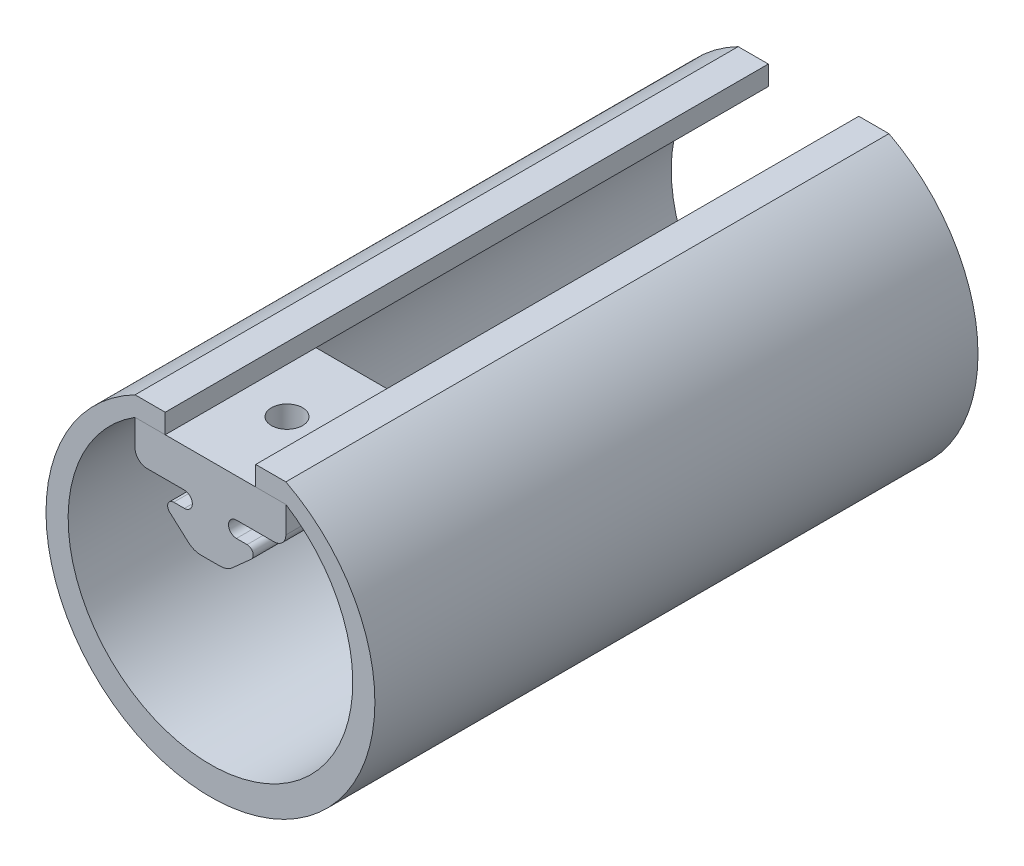
ISO-10303-21;
HEADER;
FILE_DESCRIPTION(('STEP AP214'),'2;1');
FILE_NAME('part.step','',(''),(''),'','','');
FILE_SCHEMA(('AUTOMOTIVE_DESIGN { 1 0 10303 214 1 1 1 1 }'));
ENDSEC;
DATA;
#1=APPLICATION_CONTEXT('core data for automotive mechanical design processes');
#2=APPLICATION_PROTOCOL_DEFINITION('international standard','automotive_design',2000,#1);
#3=PRODUCT_CONTEXT('',#1,'mechanical');
#4=PRODUCT('Part','Part','',(#3));
#5=PRODUCT_RELATED_PRODUCT_CATEGORY('part','',(#4));
#6=PRODUCT_DEFINITION_FORMATION('','',#4);
#7=PRODUCT_DEFINITION_CONTEXT('part definition',#1,'design');
#8=PRODUCT_DEFINITION('design','',#6,#7);
#9=PRODUCT_DEFINITION_SHAPE('','',#8);
#10=(LENGTH_UNIT() NAMED_UNIT(*) SI_UNIT(.MILLI.,.METRE.));
#11=(NAMED_UNIT(*) PLANE_ANGLE_UNIT() SI_UNIT($,.RADIAN.));
#12=(NAMED_UNIT(*) SI_UNIT($,.STERADIAN.) SOLID_ANGLE_UNIT());
#13=UNCERTAINTY_MEASURE_WITH_UNIT(LENGTH_MEASURE(1.E-05),#10,'distance_accuracy_value','');
#14=(GEOMETRIC_REPRESENTATION_CONTEXT(3) GLOBAL_UNCERTAINTY_ASSIGNED_CONTEXT((#13)) GLOBAL_UNIT_ASSIGNED_CONTEXT((#10,
#11,#12)) REPRESENTATION_CONTEXT('',''));
#15=CARTESIAN_POINT('',(0.,0.,0.));
#16=DIRECTION('',(0.,0.,1.));
#17=DIRECTION('',(1.,0.,0.));
#18=AXIS2_PLACEMENT_3D('',#15,#16,#17);
#19=CARTESIAN_POINT('',(0.00499999999999459,-0.919738421910336,-100.));
#20=DIRECTION('',(0.,0.,1.));
#21=DIRECTION('',(1.,0.,0.));
#22=AXIS2_PLACEMENT_3D('',#19,#20,#21);
#23=CYLINDRICAL_SURFACE('',#22,23.5974522798012);
#24=CARTESIAN_POINT('',(0.00499999999999459,-0.919738421910336,0.));
#25=DIRECTION('',(0.,0.,1.));
#26=DIRECTION('',(1.,0.,0.));
#27=AXIS2_PLACEMENT_3D('',#24,#25,#26);
#28=CIRCLE('',#27,23.5974522798012);
#29=CARTESIAN_POINT('',(-12.495,19.095,0.));
#30=VERTEX_POINT('',#29);
#31=CARTESIAN_POINT('',(12.505,19.095,0.));
#32=VERTEX_POINT('',#31);
#33=EDGE_CURVE('E158',#30,#32,#28,.T.);
#34=ORIENTED_EDGE('',*,*,#33,.T.);
#35=DIRECTION('',(0.,0.,1.));
#36=VECTOR('',#35,1.);
#37=CARTESIAN_POINT('',(12.505,19.095,-100.));
#38=LINE('',#37,#36);
#39=CARTESIAN_POINT('',(12.505,19.095,-100.));
#40=VERTEX_POINT('',#39);
#41=EDGE_CURVE('E12',#40,#32,#38,.T.);
#42=ORIENTED_EDGE('',*,*,#41,.F.);
#43=CARTESIAN_POINT('',(0.00499999999999459,-0.919738421910336,-100.));
#44=DIRECTION('',(0.,0.,1.));
#45=DIRECTION('',(1.,0.,0.));
#46=AXIS2_PLACEMENT_3D('',#43,#44,#45);
#47=CIRCLE('',#46,23.5974522798012);
#48=CARTESIAN_POINT('',(-12.495,19.095,-100.));
#49=VERTEX_POINT('',#48);
#50=EDGE_CURVE('E181',#49,#40,#47,.T.);
#51=ORIENTED_EDGE('',*,*,#50,.F.);
#52=DIRECTION('',(0.,0.,1.));
#53=VECTOR('',#52,1.);
#54=CARTESIAN_POINT('',(-12.495,19.095,-100.));
#55=LINE('',#54,#53);
#56=EDGE_CURVE('E62',#49,#30,#55,.T.);
#57=ORIENTED_EDGE('',*,*,#56,.T.);
#58=EDGE_LOOP('',(#34,#42,#51,#57));
#59=FACE_BOUND('',#58,.T.);
#60=ADVANCED_FACE('F59',(#59),#23,.F.);
#61=CARTESIAN_POINT('',(0.,19.095,-100.));
#62=DIRECTION('',(0.,1.,0.));
#63=DIRECTION('',(0.,0.,1.));
#64=AXIS2_PLACEMENT_3D('',#61,#62,#63);
#65=PLANE('',#64);
#66=DIRECTION('',(-1.,0.,0.));
#67=VECTOR('',#66,1.);
#68=CARTESIAN_POINT('',(0.,19.095,0.));
#69=LINE('',#68,#67);
#70=CARTESIAN_POINT('',(7.50499999999998,19.095,0.));
#71=VERTEX_POINT('',#70);
#72=EDGE_CURVE('E111',#32,#71,#69,.T.);
#73=ORIENTED_EDGE('',*,*,#72,.T.);
#74=DIRECTION('',(0.,0.,1.));
#75=VECTOR('',#74,1.);
#76=CARTESIAN_POINT('',(7.50499999999998,19.095,-100.));
#77=LINE('',#76,#75);
#78=CARTESIAN_POINT('',(7.50499999999998,19.095,-100.));
#79=VERTEX_POINT('',#78);
#80=EDGE_CURVE('E69',#79,#71,#77,.T.);
#81=ORIENTED_EDGE('',*,*,#80,.F.);
#82=DIRECTION('',(-1.,0.,0.));
#83=VECTOR('',#82,1.);
#84=CARTESIAN_POINT('',(0.,19.095,-100.));
#85=LINE('',#84,#83);
#86=EDGE_CURVE('E77',#40,#79,#85,.T.);
#87=ORIENTED_EDGE('',*,*,#86,.F.);
#88=ORIENTED_EDGE('',*,*,#41,.T.);
#89=EDGE_LOOP('',(#73,#81,#87,#88));
#90=FACE_BOUND('',#89,.T.);
#91=ADVANCED_FACE('F219',(#90),#65,.F.);
#92=CARTESIAN_POINT('',(7.50499999999998,0.,-100.));
#93=DIRECTION('',(-1.,0.,0.));
#94=DIRECTION('',(0.,0.,1.));
#95=AXIS2_PLACEMENT_3D('',#92,#93,#94);
#96=PLANE('',#95);
#97=DIRECTION('',(0.,-1.,0.));
#98=VECTOR('',#97,1.);
#99=CARTESIAN_POINT('',(7.50499999999998,0.,0.));
#100=LINE('',#99,#98);
#101=CARTESIAN_POINT('',(7.50499999999998,22.3323580948041,0.));
#102=VERTEX_POINT('',#101);
#103=EDGE_CURVE('E136',#102,#71,#100,.T.);
#104=ORIENTED_EDGE('',*,*,#103,.F.);
#105=DIRECTION('',(0.,0.,1.));
#106=VECTOR('',#105,1.);
#107=CARTESIAN_POINT('',(7.50499999999998,22.3323580948041,-100.));
#108=LINE('',#107,#106);
#109=CARTESIAN_POINT('',(7.50499999999998,22.3323580948041,-100.));
#110=VERTEX_POINT('',#109);
#111=EDGE_CURVE('E131',#110,#102,#108,.T.);
#112=ORIENTED_EDGE('',*,*,#111,.F.);
#113=DIRECTION('',(0.,-1.,0.));
#114=VECTOR('',#113,1.);
#115=CARTESIAN_POINT('',(7.50499999999998,0.,-100.));
#116=LINE('',#115,#114);
#117=EDGE_CURVE('E135',#110,#79,#116,.T.);
#118=ORIENTED_EDGE('',*,*,#117,.T.);
#119=ORIENTED_EDGE('',*,*,#80,.T.);
#120=EDGE_LOOP('',(#104,#112,#118,#119));
#121=FACE_BOUND('',#120,.T.);
#122=ADVANCED_FACE('F133',(#121),#96,.T.);
#123=CARTESIAN_POINT('',(0.,22.3323580948041,-100.));
#124=DIRECTION('',(0.,-1.,0.));
#125=DIRECTION('',(0.,0.,-1.));
#126=AXIS2_PLACEMENT_3D('',#123,#124,#125);
#127=PLANE('',#126);
#128=DIRECTION('',(1.,0.,0.));
#129=VECTOR('',#128,1.);
#130=CARTESIAN_POINT('',(0.,22.3323580948041,0.));
#131=LINE('',#130,#129);
#132=CARTESIAN_POINT('',(12.505,22.3323580948041,0.));
#133=VERTEX_POINT('',#132);
#134=EDGE_CURVE('E175',#102,#133,#131,.T.);
#135=ORIENTED_EDGE('',*,*,#134,.T.);
#136=DIRECTION('',(0.,0.,1.));
#137=VECTOR('',#136,1.);
#138=CARTESIAN_POINT('',(12.505,22.3323580948041,-100.));
#139=LINE('',#138,#137);
#140=CARTESIAN_POINT('',(12.505,22.3323580948041,-100.));
#141=VERTEX_POINT('',#140);
#142=EDGE_CURVE('E141',#141,#133,#139,.T.);
#143=ORIENTED_EDGE('',*,*,#142,.F.);
#144=DIRECTION('',(1.,0.,0.));
#145=VECTOR('',#144,1.);
#146=CARTESIAN_POINT('',(0.,22.3323580948041,-100.));
#147=LINE('',#146,#145);
#148=EDGE_CURVE('E144',#110,#141,#147,.T.);
#149=ORIENTED_EDGE('',*,*,#148,.F.);
#150=ORIENTED_EDGE('',*,*,#111,.T.);
#151=EDGE_LOOP('',(#135,#143,#149,#150));
#152=FACE_BOUND('',#151,.T.);
#153=ADVANCED_FACE('F145',(#152),#127,.F.);
#154=CARTESIAN_POINT('',(0.00499999999999459,-1.9006750931802,-100.));
#155=DIRECTION('',(0.,0.,1.));
#156=DIRECTION('',(1.,0.,0.));
#157=AXIS2_PLACEMENT_3D('',#154,#155,#156);
#158=CYLINDRICAL_SURFACE('',#157,27.2670111579899);
#159=CARTESIAN_POINT('',(0.00499999999999459,-1.9006750931802,0.));
#160=DIRECTION('',(0.,0.,1.));
#161=DIRECTION('',(1.,0.,0.));
#162=AXIS2_PLACEMENT_3D('',#159,#160,#161);
#163=CIRCLE('',#162,27.2670111579899);
#164=CARTESIAN_POINT('',(-12.495,22.3323580948041,0.));
#165=VERTEX_POINT('',#164);
#166=EDGE_CURVE('E171',#165,#133,#163,.T.);
#167=ORIENTED_EDGE('',*,*,#166,.F.);
#168=DIRECTION('',(0.,0.,1.));
#169=VECTOR('',#168,1.);
#170=CARTESIAN_POINT('',(-12.495,22.3323580948041,-100.));
#171=LINE('',#170,#169);
#172=CARTESIAN_POINT('',(-12.495,22.3323580948041,-100.));
#173=VERTEX_POINT('',#172);
#174=EDGE_CURVE('E187',#173,#165,#171,.T.);
#175=ORIENTED_EDGE('',*,*,#174,.F.);
#176=CARTESIAN_POINT('',(0.00499999999999459,-1.9006750931802,-100.));
#177=DIRECTION('',(0.,0.,1.));
#178=DIRECTION('',(1.,0.,0.));
#179=AXIS2_PLACEMENT_3D('',#176,#177,#178);
#180=CIRCLE('',#179,27.2670111579899);
#181=EDGE_CURVE('E149',#173,#141,#180,.T.);
#182=ORIENTED_EDGE('',*,*,#181,.T.);
#183=ORIENTED_EDGE('',*,*,#142,.T.);
#184=EDGE_LOOP('',(#167,#175,#182,#183));
#185=FACE_BOUND('',#184,.T.);
#186=ADVANCED_FACE('F232',(#185),#158,.T.);
#187=CARTESIAN_POINT('',(0.,22.3323580948041,-100.));
#188=DIRECTION('',(0.,-1.,0.));
#189=DIRECTION('',(0.,0.,-1.));
#190=AXIS2_PLACEMENT_3D('',#187,#188,#189);
#191=PLANE('',#190);
#192=DIRECTION('',(1.,0.,0.));
#193=VECTOR('',#192,1.);
#194=CARTESIAN_POINT('',(0.,22.3323580948041,0.));
#195=LINE('',#194,#193);
#196=CARTESIAN_POINT('',(-7.49499999999999,22.3323580948041,0.));
#197=VERTEX_POINT('',#196);
#198=EDGE_CURVE('E168',#165,#197,#195,.T.);
#199=ORIENTED_EDGE('',*,*,#198,.T.);
#200=DIRECTION('',(0.,0.,1.));
#201=VECTOR('',#200,1.);
#202=CARTESIAN_POINT('',(-7.49499999999999,22.3323580948041,-100.));
#203=LINE('',#202,#201);
#204=CARTESIAN_POINT('',(-7.49499999999999,22.3323580948041,-100.));
#205=VERTEX_POINT('',#204);
#206=EDGE_CURVE('E190',#205,#197,#203,.T.);
#207=ORIENTED_EDGE('',*,*,#206,.F.);
#208=DIRECTION('',(1.,0.,0.));
#209=VECTOR('',#208,1.);
#210=CARTESIAN_POINT('',(0.,22.3323580948041,-100.));
#211=LINE('',#210,#209);
#212=EDGE_CURVE('E246',#173,#205,#211,.T.);
#213=ORIENTED_EDGE('',*,*,#212,.F.);
#214=ORIENTED_EDGE('',*,*,#174,.T.);
#215=EDGE_LOOP('',(#199,#207,#213,#214));
#216=FACE_BOUND('',#215,.T.);
#217=ADVANCED_FACE('F215',(#216),#191,.F.);
#218=CARTESIAN_POINT('',(-7.49499999999999,0.,-100.));
#219=DIRECTION('',(-1.,0.,0.));
#220=DIRECTION('',(0.,-1.,0.));
#221=AXIS2_PLACEMENT_3D('',#218,#219,#220);
#222=PLANE('',#221);
#223=DIRECTION('',(0.,-1.,0.));
#224=VECTOR('',#223,1.);
#225=CARTESIAN_POINT('',(-7.49499999999999,0.,0.));
#226=LINE('',#225,#224);
#227=CARTESIAN_POINT('',(-7.49499999999999,19.095,0.));
#228=VERTEX_POINT('',#227);
#229=EDGE_CURVE('E165',#197,#228,#226,.T.);
#230=ORIENTED_EDGE('',*,*,#229,.T.);
#231=DIRECTION('',(0.,0.,1.));
#232=VECTOR('',#231,1.);
#233=CARTESIAN_POINT('',(-7.49499999999999,19.095,-100.));
#234=LINE('',#233,#232);
#235=CARTESIAN_POINT('',(-7.49499999999999,19.095,-100.));
#236=VERTEX_POINT('',#235);
#237=EDGE_CURVE('E193',#236,#228,#234,.T.);
#238=ORIENTED_EDGE('',*,*,#237,.F.);
#239=DIRECTION('',(0.,-1.,0.));
#240=VECTOR('',#239,1.);
#241=CARTESIAN_POINT('',(-7.49499999999999,0.,-100.));
#242=LINE('',#241,#240);
#243=EDGE_CURVE('E244',#205,#236,#242,.T.);
#244=ORIENTED_EDGE('',*,*,#243,.F.);
#245=ORIENTED_EDGE('',*,*,#206,.T.);
#246=EDGE_LOOP('',(#230,#238,#244,#245));
#247=FACE_BOUND('',#246,.T.);
#248=ADVANCED_FACE('F209',(#247),#222,.F.);
#249=CARTESIAN_POINT('',(0.,19.095,-100.));
#250=DIRECTION('',(0.,1.,0.));
#251=DIRECTION('',(0.,0.,1.));
#252=AXIS2_PLACEMENT_3D('',#249,#250,#251);
#253=PLANE('',#252);
#254=DIRECTION('',(-1.,0.,0.));
#255=VECTOR('',#254,1.);
#256=CARTESIAN_POINT('',(0.,19.095,0.));
#257=LINE('',#256,#255);
#258=EDGE_CURVE('E162',#228,#30,#257,.T.);
#259=ORIENTED_EDGE('',*,*,#258,.T.);
#260=ORIENTED_EDGE('',*,*,#56,.F.);
#261=DIRECTION('',(-1.,0.,0.));
#262=VECTOR('',#261,1.);
#263=CARTESIAN_POINT('',(0.,19.095,-100.));
#264=LINE('',#263,#262);
#265=EDGE_CURVE('E118',#236,#49,#264,.T.);
#266=ORIENTED_EDGE('',*,*,#265,.F.);
#267=ORIENTED_EDGE('',*,*,#237,.T.);
#268=EDGE_LOOP('',(#259,#260,#266,#267));
#269=FACE_BOUND('',#268,.T.);
#270=ADVANCED_FACE('F207',(#269),#253,.F.);
#271=CARTESIAN_POINT('',(0.,0.,-100.));
#272=DIRECTION('',(0.,0.,1.));
#273=DIRECTION('',(1.,0.,0.));
#274=AXIS2_PLACEMENT_3D('',#271,#272,#273);
#275=PLANE('',#274);
#276=ORIENTED_EDGE('',*,*,#50,.T.);
#277=ORIENTED_EDGE('',*,*,#86,.T.);
#278=ORIENTED_EDGE('',*,*,#117,.F.);
#279=ORIENTED_EDGE('',*,*,#148,.T.);
#280=ORIENTED_EDGE('',*,*,#181,.F.);
#281=ORIENTED_EDGE('',*,*,#212,.T.);
#282=ORIENTED_EDGE('',*,*,#243,.T.);
#283=ORIENTED_EDGE('',*,*,#265,.T.);
#284=EDGE_LOOP('',(#276,#277,#278,#279,#280,#281,#282,#283));
#285=FACE_BOUND('',#284,.T.);
#286=ADVANCED_FACE('F151',(#285),#275,.F.);
#287=CARTESIAN_POINT('',(0.,0.,0.));
#288=DIRECTION('',(0.,0.,1.));
#289=DIRECTION('',(1.,0.,0.));
#290=AXIS2_PLACEMENT_3D('',#287,#288,#289);
#291=PLANE('',#290);
#292=ORIENTED_EDGE('',*,*,#33,.F.);
#293=ORIENTED_EDGE('',*,*,#258,.F.);
#294=ORIENTED_EDGE('',*,*,#229,.F.);
#295=ORIENTED_EDGE('',*,*,#198,.F.);
#296=ORIENTED_EDGE('',*,*,#166,.T.);
#297=ORIENTED_EDGE('',*,*,#134,.F.);
#298=ORIENTED_EDGE('',*,*,#103,.T.);
#299=ORIENTED_EDGE('',*,*,#72,.F.);
#300=EDGE_LOOP('',(#292,#293,#294,#295,#296,#297,#298,#299));
#301=FACE_BOUND('',#300,.T.);
#302=ADVANCED_FACE('F204',(#301),#291,.T.);
#303=CLOSED_SHELL('',(#60,#91,#122,#153,#186,#217,#248,#270,#286,#302));
#304=MANIFOLD_SOLID_BREP('B2',#303);
#305=CARTESIAN_POINT('',(1.55040670748285,4.775,-25.));
#306=DIRECTION('',(0.,-1.,0.));
#307=DIRECTION('',(0.,0.,-1.));
#308=AXIS2_PLACEMENT_3D('',#305,#306,#307);
#309=PLANE('',#308);
#310=CARTESIAN_POINT('',(0.,4.775,-12.7));
#311=DIRECTION('',(0.,1.,0.));
#312=DIRECTION('',(1.,0.,0.));
#313=AXIS2_PLACEMENT_3D('',#310,#311,#312);
#314=CIRCLE('',#313,2.5796875);
#315=CARTESIAN_POINT('',(-1.55040670748285,4.775,-10.6381982056831));
#316=VERTEX_POINT('',#315);
#317=CARTESIAN_POINT('',(1.55040670748285,4.775,-10.6381982056831));
#318=VERTEX_POINT('',#317);
#319=EDGE_CURVE('E352',#316,#318,#314,.T.);
#320=ORIENTED_EDGE('',*,*,#319,.T.);
#321=DIRECTION('',(0.,0.,1.));
#322=VECTOR('',#321,1.);
#323=CARTESIAN_POINT('',(1.55040670748285,4.775,-25.));
#324=LINE('',#323,#322);
#325=CARTESIAN_POINT('',(1.55040670748285,4.775,0.));
#326=VERTEX_POINT('',#325);
#327=EDGE_CURVE('E567',#318,#326,#324,.T.);
#328=ORIENTED_EDGE('',*,*,#327,.T.);
#329=DIRECTION('',(1.,0.,0.));
#330=VECTOR('',#329,1.);
#331=CARTESIAN_POINT('',(1.55040670748285,4.775,0.));
#332=LINE('',#331,#330);
#333=CARTESIAN_POINT('',(-1.55040670748285,4.775,0.));
#334=VERTEX_POINT('',#333);
#335=EDGE_CURVE('E539',#334,#326,#332,.T.);
#336=ORIENTED_EDGE('',*,*,#335,.F.);
#337=DIRECTION('',(0.,0.,1.));
#338=VECTOR('',#337,1.);
#339=CARTESIAN_POINT('',(-1.55040670748285,4.775,-25.));
#340=LINE('',#339,#338);
#341=EDGE_CURVE('E571',#316,#334,#340,.T.);
#342=ORIENTED_EDGE('',*,*,#341,.F.);
#343=EDGE_LOOP('',(#320,#328,#336,#342));
#344=FACE_BOUND('',#343,.T.);
#345=ADVANCED_FACE('F335',(#344),#309,.T.);
#346=CARTESIAN_POINT('',(10.5420688349756,14.7079056929128,-25.));
#347=DIRECTION('',(0.,0.,1.));
#348=DIRECTION('',(1.,0.,0.));
#349=AXIS2_PLACEMENT_3D('',#346,#347,#348);
#350=CYLINDRICAL_SURFACE('',#349,1.96293116518964);
#351=CARTESIAN_POINT('',(10.5420688349756,14.7079056929128,0.));
#352=DIRECTION('',(0.,0.,1.));
#353=DIRECTION('',(1.,0.,0.));
#354=AXIS2_PLACEMENT_3D('',#351,#352,#353);
#355=CIRCLE('',#354,1.96293116518964);
#356=CARTESIAN_POINT('',(10.5320688348104,12.745,0.));
#357=VERTEX_POINT('',#356);
#358=CARTESIAN_POINT('',(12.505,14.7079311651897,0.));
#359=VERTEX_POINT('',#358);
#360=EDGE_CURVE('E505',#357,#359,#355,.T.);
#361=ORIENTED_EDGE('',*,*,#360,.F.);
#362=DIRECTION('',(0.,0.,1.));
#363=VECTOR('',#362,1.);
#364=CARTESIAN_POINT('',(10.5320688348104,12.745,-25.));
#365=LINE('',#364,#363);
#366=CARTESIAN_POINT('',(10.5320688348104,12.745,-25.));
#367=VERTEX_POINT('',#366);
#368=EDGE_CURVE('E57',#367,#357,#365,.T.);
#369=ORIENTED_EDGE('',*,*,#368,.F.);
#370=CARTESIAN_POINT('',(10.5420688349756,14.7079056929128,-25.));
#371=DIRECTION('',(0.,0.,1.));
#372=DIRECTION('',(1.,0.,0.));
#373=AXIS2_PLACEMENT_3D('',#370,#371,#372);
#374=CIRCLE('',#373,1.96293116518964);
#375=CARTESIAN_POINT('',(12.505,14.7079311651897,-25.));
#376=VERTEX_POINT('',#375);
#377=EDGE_CURVE('E556',#367,#376,#374,.T.);
#378=ORIENTED_EDGE('',*,*,#377,.T.);
#379=DIRECTION('',(0.,0.,1.));
#380=VECTOR('',#379,1.);
#381=CARTESIAN_POINT('',(12.505,14.7079311651897,-25.));
#382=LINE('',#381,#380);
#383=EDGE_CURVE('E339',#376,#359,#382,.T.);
#384=ORIENTED_EDGE('',*,*,#383,.T.);
#385=EDGE_LOOP('',(#361,#369,#378,#384));
#386=FACE_BOUND('',#385,.T.);
#387=ADVANCED_FACE('F337',(#386),#350,.T.);
#388=CARTESIAN_POINT('',(4.315,12.745,-25.));
#389=DIRECTION('',(0.,-1.,0.));
#390=DIRECTION('',(1.,0.,0.));
#391=AXIS2_PLACEMENT_3D('',#388,#389,#390);
#392=PLANE('',#391);
#393=DIRECTION('',(1.,0.,0.));
#394=VECTOR('',#393,1.);
#395=CARTESIAN_POINT('',(4.315,12.745,0.));
#396=LINE('',#395,#394);
#397=CARTESIAN_POINT('',(4.315,12.745,0.));
#398=VERTEX_POINT('',#397);
#399=EDGE_CURVE('E554',#398,#357,#396,.T.);
#400=ORIENTED_EDGE('',*,*,#399,.F.);
#401=DIRECTION('',(0.,0.,1.));
#402=VECTOR('',#401,1.);
#403=CARTESIAN_POINT('',(4.315,12.745,-25.));
#404=LINE('',#403,#402);
#405=CARTESIAN_POINT('',(4.315,12.745,-25.));
#406=VERTEX_POINT('',#405);
#407=EDGE_CURVE('E344',#406,#398,#404,.T.);
#408=ORIENTED_EDGE('',*,*,#407,.F.);
#409=DIRECTION('',(1.,0.,0.));
#410=VECTOR('',#409,1.);
#411=CARTESIAN_POINT('',(4.315,12.745,-25.));
#412=LINE('',#411,#410);
#413=EDGE_CURVE('E495',#406,#367,#412,.T.);
#414=ORIENTED_EDGE('',*,*,#413,.T.);
#415=ORIENTED_EDGE('',*,*,#368,.T.);
#416=EDGE_LOOP('',(#400,#408,#414,#415));
#417=FACE_BOUND('',#416,.T.);
#418=ADVANCED_FACE('F592',(#417),#392,.T.);
#419=CARTESIAN_POINT('',(4.315,11.43,-25.));
#420=DIRECTION('',(0.,0.,1.));
#421=DIRECTION('',(1.,0.,0.));
#422=AXIS2_PLACEMENT_3D('',#419,#420,#421);
#423=CYLINDRICAL_SURFACE('',#422,1.315);
#424=CARTESIAN_POINT('',(4.315,11.43,0.));
#425=DIRECTION('',(0.,0.,-1.));
#426=DIRECTION('',(-1.,0.,0.));
#427=AXIS2_PLACEMENT_3D('',#424,#425,#426);
#428=CIRCLE('',#427,1.315);
#429=CARTESIAN_POINT('',(4.315,10.115,0.));
#430=VERTEX_POINT('',#429);
#431=EDGE_CURVE('E482',#430,#398,#428,.T.);
#432=ORIENTED_EDGE('',*,*,#431,.F.);
#433=DIRECTION('',(0.,0.,1.));
#434=VECTOR('',#433,1.);
#435=CARTESIAN_POINT('',(4.315,10.115,-25.));
#436=LINE('',#435,#434);
#437=CARTESIAN_POINT('',(4.315,10.115,-25.));
#438=VERTEX_POINT('',#437);
#439=EDGE_CURVE('E476',#438,#430,#436,.T.);
#440=ORIENTED_EDGE('',*,*,#439,.F.);
#441=CARTESIAN_POINT('',(4.315,11.43,-25.));
#442=DIRECTION('',(0.,0.,-1.));
#443=DIRECTION('',(-1.,0.,0.));
#444=AXIS2_PLACEMENT_3D('',#441,#442,#443);
#445=CIRCLE('',#444,1.315);
#446=EDGE_CURVE('E479',#438,#406,#445,.T.);
#447=ORIENTED_EDGE('',*,*,#446,.T.);
#448=ORIENTED_EDGE('',*,*,#407,.T.);
#449=EDGE_LOOP('',(#432,#440,#447,#448));
#450=FACE_BOUND('',#449,.T.);
#451=ADVANCED_FACE('F478',(#450),#423,.F.);
#452=CARTESIAN_POINT('',(6.085,10.115,-25.));
#453=DIRECTION('',(0.,1.,0.));
#454=DIRECTION('',(-1.,0.,0.));
#455=AXIS2_PLACEMENT_3D('',#452,#453,#454);
#456=PLANE('',#455);
#457=DIRECTION('',(-1.,0.,0.));
#458=VECTOR('',#457,1.);
#459=CARTESIAN_POINT('',(6.085,10.115,0.));
#460=LINE('',#459,#458);
#461=CARTESIAN_POINT('',(6.085,10.115,0.));
#462=VERTEX_POINT('',#461);
#463=EDGE_CURVE('E551',#462,#430,#460,.T.);
#464=ORIENTED_EDGE('',*,*,#463,.F.);
#465=DIRECTION('',(0.,0.,1.));
#466=VECTOR('',#465,1.);
#467=CARTESIAN_POINT('',(6.085,10.115,-25.));
#468=LINE('',#467,#466);
#469=CARTESIAN_POINT('',(6.085,10.115,-25.));
#470=VERTEX_POINT('',#469);
#471=EDGE_CURVE('E487',#470,#462,#468,.T.);
#472=ORIENTED_EDGE('',*,*,#471,.F.);
#473=DIRECTION('',(-1.,0.,0.));
#474=VECTOR('',#473,1.);
#475=CARTESIAN_POINT('',(6.085,10.115,-25.));
#476=LINE('',#475,#474);
#477=EDGE_CURVE('E493',#470,#438,#476,.T.);
#478=ORIENTED_EDGE('',*,*,#477,.T.);
#479=ORIENTED_EDGE('',*,*,#439,.T.);
#480=EDGE_LOOP('',(#464,#472,#478,#479));
#481=FACE_BOUND('',#480,.T.);
#482=ADVANCED_FACE('F497',(#481),#456,.T.);
#483=CARTESIAN_POINT('',(6.085,9.105,-25.));
#484=DIRECTION('',(0.,0.,1.));
#485=DIRECTION('',(1.,0.,0.));
#486=AXIS2_PLACEMENT_3D('',#483,#484,#485);
#487=CYLINDRICAL_SURFACE('',#486,1.01);
#488=CARTESIAN_POINT('',(6.085,9.105,0.));
#489=DIRECTION('',(0.,0.,1.));
#490=DIRECTION('',(-1.,0.,0.));
#491=AXIS2_PLACEMENT_3D('',#488,#489,#490);
#492=CIRCLE('',#491,1.01);
#493=CARTESIAN_POINT('',(6.75861440261653,8.3524419380622,0.));
#494=VERTEX_POINT('',#493);
#495=EDGE_CURVE('E548',#494,#462,#492,.T.);
#496=ORIENTED_EDGE('',*,*,#495,.F.);
#497=DIRECTION('',(0.,0.,1.));
#498=VECTOR('',#497,1.);
#499=CARTESIAN_POINT('',(6.75861440261653,8.3524419380622,-25.));
#500=LINE('',#499,#498);
#501=CARTESIAN_POINT('',(6.75861440261653,8.3524419380622,-25.));
#502=VERTEX_POINT('',#501);
#503=EDGE_CURVE('E560',#502,#494,#500,.T.);
#504=ORIENTED_EDGE('',*,*,#503,.F.);
#505=CARTESIAN_POINT('',(6.085,9.105,-25.));
#506=DIRECTION('',(0.,0.,1.));
#507=DIRECTION('',(-1.,0.,0.));
#508=AXIS2_PLACEMENT_3D('',#505,#506,#507);
#509=CIRCLE('',#508,1.01);
#510=EDGE_CURVE('E498',#502,#470,#509,.T.);
#511=ORIENTED_EDGE('',*,*,#510,.T.);
#512=ORIENTED_EDGE('',*,*,#471,.T.);
#513=EDGE_LOOP('',(#496,#504,#511,#512));
#514=FACE_BOUND('',#513,.T.);
#515=ADVANCED_FACE('F809',(#514),#487,.T.);
#516=CARTESIAN_POINT('',(3.66462220876442,5.58301083530413,-25.));
#517=DIRECTION('',(0.66694495308567,-0.745106992017625,0.));
#518=DIRECTION('',(0.745106992017625,0.66694495308567,0.));
#519=AXIS2_PLACEMENT_3D('',#516,#517,#518);
#520=PLANE('',#519);
#521=DIRECTION('',(0.745106992017625,0.66694495308567,0.));
#522=VECTOR('',#521,1.);
#523=CARTESIAN_POINT('',(3.66462220876442,5.58301083530413,0.));
#524=LINE('',#523,#522);
#525=CARTESIAN_POINT('',(3.66462220876443,5.58301083530413,0.));
#526=VERTEX_POINT('',#525);
#527=EDGE_CURVE('E545',#526,#494,#524,.T.);
#528=ORIENTED_EDGE('',*,*,#527,.F.);
#529=DIRECTION('',(0.,0.,1.));
#530=VECTOR('',#529,1.);
#531=CARTESIAN_POINT('',(3.66462220876443,5.58301083530413,-25.));
#532=LINE('',#531,#530);
#533=CARTESIAN_POINT('',(3.66462220876443,5.58301083530413,-25.));
#534=VERTEX_POINT('',#533);
#535=EDGE_CURVE('E562',#534,#526,#532,.T.);
#536=ORIENTED_EDGE('',*,*,#535,.F.);
#537=DIRECTION('',(0.745106992017625,0.66694495308567,0.));
#538=VECTOR('',#537,1.);
#539=CARTESIAN_POINT('',(3.66462220876442,5.58301083530413,-25.));
#540=LINE('',#539,#538);
#541=EDGE_CURVE('E500',#534,#502,#540,.T.);
#542=ORIENTED_EDGE('',*,*,#541,.T.);
#543=ORIENTED_EDGE('',*,*,#503,.T.);
#544=EDGE_LOOP('',(#528,#536,#542,#543));
#545=FACE_BOUND('',#544,.T.);
#546=ADVANCED_FACE('F619',(#545),#520,.T.);
#547=CARTESIAN_POINT('',(1.55040670748285,7.945,-25.));
#548=DIRECTION('',(0.,0.,1.));
#549=DIRECTION('',(1.,0.,0.));
#550=AXIS2_PLACEMENT_3D('',#547,#548,#549);
#551=CYLINDRICAL_SURFACE('',#550,3.17);
#552=CARTESIAN_POINT('',(1.55040670748285,4.775,-14.7618017943169));
#553=CARTESIAN_POINT('',(1.60740604045821,4.77499829120057,-14.7189442153994));
#554=CARTESIAN_POINT('',(1.66257781547106,4.77653731473618,-14.6737514092));
#555=CARTESIAN_POINT('',(1.76889322437959,4.78209114792903,-14.5790601482722));
#556=CARTESIAN_POINT('',(1.8200397355736,4.78610417068436,-14.5295648232791));
#557=CARTESIAN_POINT('',(1.96675242160227,4.80092576356998,-14.3753361028821));
#558=CARTESIAN_POINT('',(2.05588565359025,4.81452303115963,-14.2646380502744));
#559=CARTESIAN_POINT('',(2.21449192978436,4.84428771040433,-14.0307074588259));
#560=CARTESIAN_POINT('',(2.28400175412247,4.86045022395167,-13.9074989658865));
#561=CARTESIAN_POINT('',(2.40208492778134,4.89094173572603,-13.6511445881945));
#562=CARTESIAN_POINT('',(2.45065409260614,4.90527036709316,-13.5179967235234));
#563=CARTESIAN_POINT('',(2.5265358132137,4.92875618427653,-13.2409544194539));
#564=CARTESIAN_POINT('',(2.55316856059788,4.93774573071455,-13.0968575992915));
#565=CARTESIAN_POINT('',(2.58164280081133,4.94738521681886,-12.8059969458529));
#566=CARTESIAN_POINT('',(2.5834968215375,4.94803937077535,-12.6592344978822));
#567=CARTESIAN_POINT('',(2.56292430361789,4.94103637635508,-12.3753134598267));
#568=CARTESIAN_POINT('',(2.54174874989054,4.93380739133914,-12.238050777274));
#569=CARTESIAN_POINT('',(2.47782190838669,4.91351351507231,-11.969028095893));
#570=CARTESIAN_POINT('',(2.43505524938557,4.90044446690321,-11.8372720898594));
#571=CARTESIAN_POINT('',(2.32818141432141,4.87138999447564,-11.5801199210287));
#572=CARTESIAN_POINT('',(2.26368296217278,4.85535372422185,-11.4548928775934));
#573=CARTESIAN_POINT('',(2.11514865887475,4.82479365840991,-11.2165573027427));
#574=CARTESIAN_POINT('',(2.03113896127296,4.81026787554665,-11.1034328425033));
#575=CARTESIAN_POINT('',(1.88018012417873,4.7916558313887,-10.9315294685844));
#576=CARTESIAN_POINT('',(1.8185579372326,4.78569660671739,-10.8682201108708));
#577=CARTESIAN_POINT('',(1.68903568915766,4.77736654680655,-10.748139136869));
#578=CARTESIAN_POINT('',(1.62113573935703,4.77499564794554,-10.6913674046842));
#579=CARTESIAN_POINT('',(1.55040670748285,4.775,-10.6381982056831));
#580=B_SPLINE_CURVE_WITH_KNOTS('',3,(#552,#553,#554,#555,#556,#557,#558,#559,#560,#561,#562,
#563,#564,#565,#566,#567,#568,#569,#570,#571,#572,#573,#574,#575,#576,#577,#578,#579),
.UNSPECIFIED.,.F.,.F.,(4,2,2,2,2,2,2,2,2,2,2,2,2,4),(0.,0.213764562147627,0.427374908600162,
0.853505887428197,1.27883278487419,1.70424463450298,2.14239063810355,2.58031511071875,
2.99558733329452,3.41115561588503,3.83464594255289,4.25757185141178,4.52272455689054,
4.78787256112298),.UNSPECIFIED.);
#581=CARTESIAN_POINT('',(1.55040670748285,4.775,-14.7618017943169));
#582=VERTEX_POINT('',#581);
#583=EDGE_CURVE('E509',#582,#318,#580,.T.);
#584=ORIENTED_EDGE('',*,*,#583,.F.);
#585=CARTESIAN_POINT('',(1.55040670748285,4.775,-25.));
#586=VERTEX_POINT('',#585);
#587=EDGE_CURVE('E564',#586,#582,#324,.T.);
#588=ORIENTED_EDGE('',*,*,#587,.F.);
#589=CARTESIAN_POINT('',(1.55040670748285,7.945,-25.));
#590=DIRECTION('',(0.,0.,1.));
#591=DIRECTION('',(-1.,0.,0.));
#592=AXIS2_PLACEMENT_3D('',#589,#590,#591);
#593=CIRCLE('',#592,3.17);
#594=EDGE_CURVE('E641',#586,#534,#593,.T.);
#595=ORIENTED_EDGE('',*,*,#594,.T.);
#596=ORIENTED_EDGE('',*,*,#535,.T.);
#597=CARTESIAN_POINT('',(1.55040670748285,7.945,0.));
#598=DIRECTION('',(0.,0.,1.));
#599=DIRECTION('',(-1.,0.,0.));
#600=AXIS2_PLACEMENT_3D('',#597,#598,#599);
#601=CIRCLE('',#600,3.17);
#602=EDGE_CURVE('E542',#326,#526,#601,.T.);
#603=ORIENTED_EDGE('',*,*,#602,.F.);
#604=ORIENTED_EDGE('',*,*,#327,.F.);
#605=EDGE_LOOP('',(#584,#588,#595,#596,#603,#604));
#606=FACE_BOUND('',#605,.T.);
#607=ADVANCED_FACE('F611',(#606),#551,.T.);
#608=CARTESIAN_POINT('',(-1.55040670748285,4.775,-14.7618017943169));
#609=VERTEX_POINT('',#608);
#610=EDGE_CURVE('E624',#582,#609,#314,.T.);
#611=ORIENTED_EDGE('',*,*,#610,.T.);
#612=CARTESIAN_POINT('',(-1.55040670748285,4.775,-25.));
#613=VERTEX_POINT('',#612);
#614=EDGE_CURVE('E568',#613,#609,#340,.T.);
#615=ORIENTED_EDGE('',*,*,#614,.F.);
#616=DIRECTION('',(1.,0.,0.));
#617=VECTOR('',#616,1.);
#618=CARTESIAN_POINT('',(1.55040670748285,4.775,-25.));
#619=LINE('',#618,#617);
#620=EDGE_CURVE('E638',#613,#586,#619,.T.);
#621=ORIENTED_EDGE('',*,*,#620,.T.);
#622=ORIENTED_EDGE('',*,*,#587,.T.);
#623=EDGE_LOOP('',(#611,#615,#621,#622));
#624=FACE_BOUND('',#623,.T.);
#625=ADVANCED_FACE('F604',(#624),#309,.T.);
#626=CARTESIAN_POINT('',(-1.55040670748285,7.945,-25.));
#627=DIRECTION('',(0.,0.,1.));
#628=DIRECTION('',(1.,0.,0.));
#629=AXIS2_PLACEMENT_3D('',#626,#627,#628);
#630=CYLINDRICAL_SURFACE('',#629,3.17);
#631=CARTESIAN_POINT('',(-1.55040670748285,4.775,-10.6381982056831));
#632=CARTESIAN_POINT('',(-1.60740604045821,4.77499829120057,-10.6810557846006));
#633=CARTESIAN_POINT('',(-1.66257781547106,4.77653731473618,-10.7262485908));
#634=CARTESIAN_POINT('',(-1.76889322437958,4.78209114792903,-10.8209398517278));
#635=CARTESIAN_POINT('',(-1.8200397355736,4.78610417068436,-10.8704351767209));
#636=CARTESIAN_POINT('',(-1.96675242160227,4.80092576356998,-11.0246638971179));
#637=CARTESIAN_POINT('',(-2.05588565359025,4.81452303115963,-11.1353619497256));
#638=CARTESIAN_POINT('',(-2.21449192978436,4.84428771040433,-11.3692925411741));
#639=CARTESIAN_POINT('',(-2.28400175412247,4.86045022395167,-11.4925010341135));
#640=CARTESIAN_POINT('',(-2.40208492778134,4.89094173572603,-11.7488554118055));
#641=CARTESIAN_POINT('',(-2.45065409260614,4.90527036709316,-11.8820032764766));
#642=CARTESIAN_POINT('',(-2.5265358132137,4.92875618427653,-12.1590455805461));
#643=CARTESIAN_POINT('',(-2.55316856059788,4.93774573071455,-12.3031424007085));
#644=CARTESIAN_POINT('',(-2.58164280081134,4.94738521681886,-12.5940030541471));
#645=CARTESIAN_POINT('',(-2.5834968215375,4.94803937077535,-12.7407655021178));
#646=CARTESIAN_POINT('',(-2.56292430361789,4.94103637635508,-13.0246865401733));
#647=CARTESIAN_POINT('',(-2.54174874989054,4.93380739133914,-13.161949222726));
#648=CARTESIAN_POINT('',(-2.47782190838669,4.91351351507232,-13.430971904107));
#649=CARTESIAN_POINT('',(-2.43505524938557,4.90044446690321,-13.5627279101406));
#650=CARTESIAN_POINT('',(-2.32818141432142,4.87138999447565,-13.8198800789713));
#651=CARTESIAN_POINT('',(-2.26368296217278,4.85535372422185,-13.9451071224066));
#652=CARTESIAN_POINT('',(-2.11514865887475,4.82479365840991,-14.1834426972573));
#653=CARTESIAN_POINT('',(-2.03113896127297,4.81026787554665,-14.2965671574967));
#654=CARTESIAN_POINT('',(-1.88018012417873,4.7916558313887,-14.4684705314156));
#655=CARTESIAN_POINT('',(-1.8185579372326,4.78569660671739,-14.5317798891292));
#656=CARTESIAN_POINT('',(-1.68903568915766,4.77736654680655,-14.651860863131));
#657=CARTESIAN_POINT('',(-1.62113573935704,4.77499564794554,-14.7086325953158));
#658=CARTESIAN_POINT('',(-1.55040670748285,4.775,-14.7618017943169));
#659=B_SPLINE_CURVE_WITH_KNOTS('',3,(#631,#632,#633,#634,#635,#636,#637,#638,#639,#640,#641,
#642,#643,#644,#645,#646,#647,#648,#649,#650,#651,#652,#653,#654,#655,#656,#657,#658),
.UNSPECIFIED.,.F.,.F.,(4,2,2,2,2,2,2,2,2,2,2,2,2,4),(0.,0.213764562147627,0.427374908600162,
0.853505887428196,1.27883278487418,1.70424463450298,2.14239063810355,2.58031511071874,
2.99558733329451,3.41115561588503,3.83464594255288,4.25757185141178,4.52272455689054,
4.78787256112298),.UNSPECIFIED.);
#660=EDGE_CURVE('E629',#316,#609,#659,.T.);
#661=ORIENTED_EDGE('',*,*,#660,.F.);
#662=ORIENTED_EDGE('',*,*,#341,.T.);
#663=CARTESIAN_POINT('',(-1.55040670748285,7.945,0.));
#664=DIRECTION('',(0.,0.,1.));
#665=DIRECTION('',(1.,0.,0.));
#666=AXIS2_PLACEMENT_3D('',#663,#664,#665);
#667=CIRCLE('',#666,3.17);
#668=CARTESIAN_POINT('',(-3.66462220876442,5.58301083530413,0.));
#669=VERTEX_POINT('',#668);
#670=EDGE_CURVE('E536',#669,#334,#667,.T.);
#671=ORIENTED_EDGE('',*,*,#670,.F.);
#672=DIRECTION('',(0.,0.,1.));
#673=VECTOR('',#672,1.);
#674=CARTESIAN_POINT('',(-3.66462220876442,5.58301083530413,-25.));
#675=LINE('',#674,#673);
#676=CARTESIAN_POINT('',(-3.66462220876442,5.58301083530413,-25.));
#677=VERTEX_POINT('',#676);
#678=EDGE_CURVE('E572',#677,#669,#675,.T.);
#679=ORIENTED_EDGE('',*,*,#678,.F.);
#680=CARTESIAN_POINT('',(-1.55040670748285,7.945,-25.));
#681=DIRECTION('',(0.,0.,1.));
#682=DIRECTION('',(1.,0.,0.));
#683=AXIS2_PLACEMENT_3D('',#680,#681,#682);
#684=CIRCLE('',#683,3.17);
#685=EDGE_CURVE('E634',#677,#613,#684,.T.);
#686=ORIENTED_EDGE('',*,*,#685,.T.);
#687=ORIENTED_EDGE('',*,*,#614,.T.);
#688=EDGE_LOOP('',(#661,#662,#671,#679,#686,#687));
#689=FACE_BOUND('',#688,.T.);
#690=ADVANCED_FACE('F610',(#689),#630,.T.);
#691=CARTESIAN_POINT('',(-3.66462220876442,5.58301083530413,-25.));
#692=DIRECTION('',(-0.66694495308567,-0.745106992017626,0.));
#693=DIRECTION('',(0.745106992017626,-0.66694495308567,0.));
#694=AXIS2_PLACEMENT_3D('',#691,#692,#693);
#695=PLANE('',#694);
#696=DIRECTION('',(0.745106992017625,-0.66694495308567,0.));
#697=VECTOR('',#696,1.);
#698=CARTESIAN_POINT('',(-3.66462220876442,5.58301083530413,0.));
#699=LINE('',#698,#697);
#700=CARTESIAN_POINT('',(-6.75861440261652,8.3524419380622,0.));
#701=VERTEX_POINT('',#700);
#702=EDGE_CURVE('E533',#701,#669,#699,.T.);
#703=ORIENTED_EDGE('',*,*,#702,.F.);
#704=DIRECTION('',(0.,0.,1.));
#705=VECTOR('',#704,1.);
#706=CARTESIAN_POINT('',(-6.75861440261652,8.3524419380622,-25.));
#707=LINE('',#706,#705);
#708=CARTESIAN_POINT('',(-6.75861440261652,8.3524419380622,-25.));
#709=VERTEX_POINT('',#708);
#710=EDGE_CURVE('E574',#709,#701,#707,.T.);
#711=ORIENTED_EDGE('',*,*,#710,.F.);
#712=DIRECTION('',(0.745106992017625,-0.66694495308567,0.));
#713=VECTOR('',#712,1.);
#714=CARTESIAN_POINT('',(-3.66462220876442,5.58301083530413,-25.));
#715=LINE('',#714,#713);
#716=EDGE_CURVE('E639',#709,#677,#715,.T.);
#717=ORIENTED_EDGE('',*,*,#716,.T.);
#718=ORIENTED_EDGE('',*,*,#678,.T.);
#719=EDGE_LOOP('',(#703,#711,#717,#718));
#720=FACE_BOUND('',#719,.T.);
#721=ADVANCED_FACE('F617',(#720),#695,.T.);
#722=CARTESIAN_POINT('',(-6.085,9.105,-25.));
#723=DIRECTION('',(0.,0.,1.));
#724=DIRECTION('',(1.,0.,0.));
#725=AXIS2_PLACEMENT_3D('',#722,#723,#724);
#726=CYLINDRICAL_SURFACE('',#725,1.01);
#727=CARTESIAN_POINT('',(-6.085,9.105,0.));
#728=DIRECTION('',(0.,0.,1.));
#729=DIRECTION('',(1.,0.,0.));
#730=AXIS2_PLACEMENT_3D('',#727,#728,#729);
#731=CIRCLE('',#730,1.01);
#732=CARTESIAN_POINT('',(-6.085,10.115,0.));
#733=VERTEX_POINT('',#732);
#734=EDGE_CURVE('E530',#733,#701,#731,.T.);
#735=ORIENTED_EDGE('',*,*,#734,.F.);
#736=DIRECTION('',(0.,0.,1.));
#737=VECTOR('',#736,1.);
#738=CARTESIAN_POINT('',(-6.085,10.115,-25.));
#739=LINE('',#738,#737);
#740=CARTESIAN_POINT('',(-6.085,10.115,-25.));
#741=VERTEX_POINT('',#740);
#742=EDGE_CURVE('E576',#741,#733,#739,.T.);
#743=ORIENTED_EDGE('',*,*,#742,.F.);
#744=CARTESIAN_POINT('',(-6.085,9.105,-25.));
#745=DIRECTION('',(0.,0.,1.));
#746=DIRECTION('',(1.,0.,0.));
#747=AXIS2_PLACEMENT_3D('',#744,#745,#746);
#748=CIRCLE('',#747,1.01);
#749=EDGE_CURVE('E643',#741,#709,#748,.T.);
#750=ORIENTED_EDGE('',*,*,#749,.T.);
#751=ORIENTED_EDGE('',*,*,#710,.T.);
#752=EDGE_LOOP('',(#735,#743,#750,#751));
#753=FACE_BOUND('',#752,.T.);
#754=ADVANCED_FACE('F785',(#753),#726,.T.);
#755=CARTESIAN_POINT('',(-6.085,10.115,-25.));
#756=DIRECTION('',(0.,1.,0.));
#757=DIRECTION('',(-1.,0.,0.));
#758=AXIS2_PLACEMENT_3D('',#755,#756,#757);
#759=PLANE('',#758);
#760=DIRECTION('',(-1.,0.,0.));
#761=VECTOR('',#760,1.);
#762=CARTESIAN_POINT('',(-6.085,10.115,0.));
#763=LINE('',#762,#761);
#764=CARTESIAN_POINT('',(-4.315,10.115,0.));
#765=VERTEX_POINT('',#764);
#766=EDGE_CURVE('E527',#765,#733,#763,.T.);
#767=ORIENTED_EDGE('',*,*,#766,.F.);
#768=DIRECTION('',(0.,0.,1.));
#769=VECTOR('',#768,1.);
#770=CARTESIAN_POINT('',(-4.315,10.115,-25.));
#771=LINE('',#770,#769);
#772=CARTESIAN_POINT('',(-4.315,10.115,-25.));
#773=VERTEX_POINT('',#772);
#774=EDGE_CURVE('E578',#773,#765,#771,.T.);
#775=ORIENTED_EDGE('',*,*,#774,.F.);
#776=DIRECTION('',(-1.,0.,0.));
#777=VECTOR('',#776,1.);
#778=CARTESIAN_POINT('',(-6.085,10.115,-25.));
#779=LINE('',#778,#777);
#780=EDGE_CURVE('E872',#773,#741,#779,.T.);
#781=ORIENTED_EDGE('',*,*,#780,.T.);
#782=ORIENTED_EDGE('',*,*,#742,.T.);
#783=EDGE_LOOP('',(#767,#775,#781,#782));
#784=FACE_BOUND('',#783,.T.);
#785=ADVANCED_FACE('F775',(#784),#759,.T.);
#786=CARTESIAN_POINT('',(-4.315,11.43,-25.));
#787=DIRECTION('',(0.,0.,1.));
#788=DIRECTION('',(1.,0.,0.));
#789=AXIS2_PLACEMENT_3D('',#786,#787,#788);
#790=CYLINDRICAL_SURFACE('',#789,1.315);
#791=CARTESIAN_POINT('',(-4.315,11.43,0.));
#792=DIRECTION('',(0.,0.,-1.));
#793=DIRECTION('',(1.,0.,0.));
#794=AXIS2_PLACEMENT_3D('',#791,#792,#793);
#795=CIRCLE('',#794,1.315);
#796=CARTESIAN_POINT('',(-4.315,12.745,0.));
#797=VERTEX_POINT('',#796);
#798=EDGE_CURVE('E524',#797,#765,#795,.T.);
#799=ORIENTED_EDGE('',*,*,#798,.F.);
#800=DIRECTION('',(0.,0.,1.));
#801=VECTOR('',#800,1.);
#802=CARTESIAN_POINT('',(-4.315,12.745,-25.));
#803=LINE('',#802,#801);
#804=CARTESIAN_POINT('',(-4.315,12.745,-25.));
#805=VERTEX_POINT('',#804);
#806=EDGE_CURVE('E580',#805,#797,#803,.T.);
#807=ORIENTED_EDGE('',*,*,#806,.F.);
#808=CARTESIAN_POINT('',(-4.315,11.43,-25.));
#809=DIRECTION('',(0.,0.,-1.));
#810=DIRECTION('',(1.,0.,0.));
#811=AXIS2_PLACEMENT_3D('',#808,#809,#810);
#812=CIRCLE('',#811,1.315);
#813=EDGE_CURVE('E868',#805,#773,#812,.T.);
#814=ORIENTED_EDGE('',*,*,#813,.T.);
#815=ORIENTED_EDGE('',*,*,#774,.T.);
#816=EDGE_LOOP('',(#799,#807,#814,#815));
#817=FACE_BOUND('',#816,.T.);
#818=ADVANCED_FACE('F765',(#817),#790,.F.);
#819=CARTESIAN_POINT('',(-4.315,12.745,-25.));
#820=DIRECTION('',(0.,-1.,0.));
#821=DIRECTION('',(1.,0.,0.));
#822=AXIS2_PLACEMENT_3D('',#819,#820,#821);
#823=PLANE('',#822);
#824=DIRECTION('',(1.,0.,0.));
#825=VECTOR('',#824,1.);
#826=CARTESIAN_POINT('',(-4.315,12.745,0.));
#827=LINE('',#826,#825);
#828=CARTESIAN_POINT('',(-10.5320688348104,12.745,0.));
#829=VERTEX_POINT('',#828);
#830=EDGE_CURVE('E521',#829,#797,#827,.T.);
#831=ORIENTED_EDGE('',*,*,#830,.F.);
#832=DIRECTION('',(0.,0.,1.));
#833=VECTOR('',#832,1.);
#834=CARTESIAN_POINT('',(-10.5320688348104,12.745,-25.));
#835=LINE('',#834,#833);
#836=CARTESIAN_POINT('',(-10.5320688348104,12.745,-25.));
#837=VERTEX_POINT('',#836);
#838=EDGE_CURVE('E582',#837,#829,#835,.T.);
#839=ORIENTED_EDGE('',*,*,#838,.F.);
#840=DIRECTION('',(1.,0.,0.));
#841=VECTOR('',#840,1.);
#842=CARTESIAN_POINT('',(-4.315,12.745,-25.));
#843=LINE('',#842,#841);
#844=EDGE_CURVE('E879',#837,#805,#843,.T.);
#845=ORIENTED_EDGE('',*,*,#844,.T.);
#846=ORIENTED_EDGE('',*,*,#806,.T.);
#847=EDGE_LOOP('',(#831,#839,#845,#846));
#848=FACE_BOUND('',#847,.T.);
#849=ADVANCED_FACE('F755',(#848),#823,.T.);
#850=CARTESIAN_POINT('',(-10.5320688348104,14.7079311651896,-25.));
#851=DIRECTION('',(0.,0.,1.));
#852=DIRECTION('',(1.,0.,0.));
#853=AXIS2_PLACEMENT_3D('',#850,#851,#852);
#854=CYLINDRICAL_SURFACE('',#853,1.96293116518964);
#855=CARTESIAN_POINT('',(-10.5320688348104,14.7079311651896,0.));
#856=DIRECTION('',(0.,0.,1.));
#857=DIRECTION('',(-1.,0.,0.));
#858=AXIS2_PLACEMENT_3D('',#855,#856,#857);
#859=CIRCLE('',#858,1.96293116518964);
#860=CARTESIAN_POINT('',(-12.495,14.7079311651897,0.));
#861=VERTEX_POINT('',#860);
#862=EDGE_CURVE('E518',#861,#829,#859,.T.);
#863=ORIENTED_EDGE('',*,*,#862,.F.);
#864=DIRECTION('',(0.,0.,1.));
#865=VECTOR('',#864,1.);
#866=CARTESIAN_POINT('',(-12.495,14.7079311651897,-25.));
#867=LINE('',#866,#865);
#868=CARTESIAN_POINT('',(-12.495,14.7079311651897,-25.));
#869=VERTEX_POINT('',#868);
#870=EDGE_CURVE('E584',#869,#861,#867,.T.);
#871=ORIENTED_EDGE('',*,*,#870,.F.);
#872=CARTESIAN_POINT('',(-10.5320688348104,14.7079311651896,-25.));
#873=DIRECTION('',(0.,0.,1.));
#874=DIRECTION('',(-1.,0.,0.));
#875=AXIS2_PLACEMENT_3D('',#872,#873,#874);
#876=CIRCLE('',#875,1.96293116518964);
#877=EDGE_CURVE('E861',#869,#837,#876,.T.);
#878=ORIENTED_EDGE('',*,*,#877,.T.);
#879=ORIENTED_EDGE('',*,*,#838,.T.);
#880=EDGE_LOOP('',(#863,#871,#878,#879));
#881=FACE_BOUND('',#880,.T.);
#882=ADVANCED_FACE('F745',(#881),#854,.T.);
#883=CARTESIAN_POINT('',(-12.495,14.7079311651897,-25.));
#884=DIRECTION('',(-1.,0.,0.));
#885=DIRECTION('',(0.,0.,1.));
#886=AXIS2_PLACEMENT_3D('',#883,#884,#885);
#887=PLANE('',#886);
#888=DIRECTION('',(0.,-1.,0.));
#889=VECTOR('',#888,1.);
#890=CARTESIAN_POINT('',(-12.495,14.7079311651897,0.));
#891=LINE('',#890,#889);
#892=CARTESIAN_POINT('',(-12.495,19.095,0.));
#893=VERTEX_POINT('',#892);
#894=EDGE_CURVE('E515',#893,#861,#891,.T.);
#895=ORIENTED_EDGE('',*,*,#894,.F.);
#896=DIRECTION('',(0.,0.,1.));
#897=VECTOR('',#896,1.);
#898=CARTESIAN_POINT('',(-12.495,19.095,-25.));
#899=LINE('',#898,#897);
#900=CARTESIAN_POINT('',(-12.495,19.095,-25.));
#901=VERTEX_POINT('',#900);
#902=EDGE_CURVE('E586',#901,#893,#899,.T.);
#903=ORIENTED_EDGE('',*,*,#902,.F.);
#904=DIRECTION('',(0.,-1.,0.));
#905=VECTOR('',#904,1.);
#906=CARTESIAN_POINT('',(-12.495,14.7079311651897,-25.));
#907=LINE('',#906,#905);
#908=EDGE_CURVE('E857',#901,#869,#907,.T.);
#909=ORIENTED_EDGE('',*,*,#908,.T.);
#910=ORIENTED_EDGE('',*,*,#870,.T.);
#911=EDGE_LOOP('',(#895,#903,#909,#910));
#912=FACE_BOUND('',#911,.T.);
#913=ADVANCED_FACE('F700',(#912),#887,.T.);
#914=CARTESIAN_POINT('',(-12.495,19.095,-25.));
#915=DIRECTION('',(0.,1.,0.));
#916=DIRECTION('',(0.,0.,1.));
#917=AXIS2_PLACEMENT_3D('',#914,#915,#916);
#918=PLANE('',#917);
#919=CARTESIAN_POINT('',(0.,19.095,-12.7));
#920=DIRECTION('',(0.,1.,0.));
#921=DIRECTION('',(1.,0.,0.));
#922=AXIS2_PLACEMENT_3D('',#919,#920,#921);
#923=CIRCLE('',#922,2.5796875);
#924=CARTESIAN_POINT('',(2.5796875,19.095,-12.7));
#925=VERTEX_POINT('',#924);
#926=EDGE_CURVE('E846',#925,#925,#923,.T.);
#927=ORIENTED_EDGE('',*,*,#926,.F.);
#928=EDGE_LOOP('',(#927));
#929=FACE_BOUND('',#928,.T.);
#930=DIRECTION('',(-1.,0.,0.));
#931=VECTOR('',#930,1.);
#932=CARTESIAN_POINT('',(-12.495,19.095,0.));
#933=LINE('',#932,#931);
#934=CARTESIAN_POINT('',(12.505,19.095,0.));
#935=VERTEX_POINT('',#934);
#936=EDGE_CURVE('E512',#935,#893,#933,.T.);
#937=ORIENTED_EDGE('',*,*,#936,.F.);
#938=DIRECTION('',(0.,0.,1.));
#939=VECTOR('',#938,1.);
#940=CARTESIAN_POINT('',(12.505,19.095,-25.));
#941=LINE('',#940,#939);
#942=CARTESIAN_POINT('',(12.505,19.095,-25.));
#943=VERTEX_POINT('',#942);
#944=EDGE_CURVE('E587',#943,#935,#941,.T.);
#945=ORIENTED_EDGE('',*,*,#944,.F.);
#946=DIRECTION('',(-1.,0.,0.));
#947=VECTOR('',#946,1.);
#948=CARTESIAN_POINT('',(-12.495,19.095,-25.));
#949=LINE('',#948,#947);
#950=EDGE_CURVE('E883',#943,#901,#949,.T.);
#951=ORIENTED_EDGE('',*,*,#950,.T.);
#952=ORIENTED_EDGE('',*,*,#902,.T.);
#953=EDGE_LOOP('',(#937,#945,#951,#952));
#954=FACE_BOUND('',#953,.T.);
#955=ADVANCED_FACE('F695',(#929,#954),#918,.T.);
#956=CARTESIAN_POINT('',(12.505,14.7079311651897,-25.));
#957=DIRECTION('',(1.,0.,0.));
#958=DIRECTION('',(0.,0.,-1.));
#959=AXIS2_PLACEMENT_3D('',#956,#957,#958);
#960=PLANE('',#959);
#961=DIRECTION('',(0.,1.,0.));
#962=VECTOR('',#961,1.);
#963=CARTESIAN_POINT('',(12.505,14.7079311651897,0.));
#964=LINE('',#963,#962);
#965=EDGE_CURVE('E508',#359,#935,#964,.T.);
#966=ORIENTED_EDGE('',*,*,#965,.F.);
#967=ORIENTED_EDGE('',*,*,#383,.F.);
#968=DIRECTION('',(0.,1.,0.));
#969=VECTOR('',#968,1.);
#970=CARTESIAN_POINT('',(12.505,14.7079311651897,-25.));
#971=LINE('',#970,#969);
#972=EDGE_CURVE('E884',#376,#943,#971,.T.);
#973=ORIENTED_EDGE('',*,*,#972,.T.);
#974=ORIENTED_EDGE('',*,*,#944,.T.);
#975=EDGE_LOOP('',(#966,#967,#973,#974));
#976=FACE_BOUND('',#975,.T.);
#977=ADVANCED_FACE('F589',(#976),#960,.T.);
#978=CARTESIAN_POINT('',(10.5420688349756,14.7079056929128,-25.));
#979=DIRECTION('',(0.,0.,1.));
#980=DIRECTION('',(1.,0.,0.));
#981=AXIS2_PLACEMENT_3D('',#978,#979,#980);
#982=PLANE('',#981);
#983=ORIENTED_EDGE('',*,*,#377,.F.);
#984=ORIENTED_EDGE('',*,*,#413,.F.);
#985=ORIENTED_EDGE('',*,*,#446,.F.);
#986=ORIENTED_EDGE('',*,*,#477,.F.);
#987=ORIENTED_EDGE('',*,*,#510,.F.);
#988=ORIENTED_EDGE('',*,*,#541,.F.);
#989=ORIENTED_EDGE('',*,*,#594,.F.);
#990=ORIENTED_EDGE('',*,*,#620,.F.);
#991=ORIENTED_EDGE('',*,*,#685,.F.);
#992=ORIENTED_EDGE('',*,*,#716,.F.);
#993=ORIENTED_EDGE('',*,*,#749,.F.);
#994=ORIENTED_EDGE('',*,*,#780,.F.);
#995=ORIENTED_EDGE('',*,*,#813,.F.);
#996=ORIENTED_EDGE('',*,*,#844,.F.);
#997=ORIENTED_EDGE('',*,*,#877,.F.);
#998=ORIENTED_EDGE('',*,*,#908,.F.);
#999=ORIENTED_EDGE('',*,*,#950,.F.);
#1000=ORIENTED_EDGE('',*,*,#972,.F.);
#1001=EDGE_LOOP('',(#983,#984,#985,#986,#987,#988,#989,#990,#991,#992,#993,#994,#995,#996,#997,
#998,#999,#1000));
#1002=FACE_BOUND('',#1001,.T.);
#1003=ADVANCED_FACE('F491',(#1002),#982,.F.);
#1004=CARTESIAN_POINT('',(10.5420688349756,14.7079056929128,0.));
#1005=DIRECTION('',(0.,0.,1.));
#1006=DIRECTION('',(1.,0.,0.));
#1007=AXIS2_PLACEMENT_3D('',#1004,#1005,#1006);
#1008=PLANE('',#1007);
#1009=ORIENTED_EDGE('',*,*,#360,.T.);
#1010=ORIENTED_EDGE('',*,*,#965,.T.);
#1011=ORIENTED_EDGE('',*,*,#936,.T.);
#1012=ORIENTED_EDGE('',*,*,#894,.T.);
#1013=ORIENTED_EDGE('',*,*,#862,.T.);
#1014=ORIENTED_EDGE('',*,*,#830,.T.);
#1015=ORIENTED_EDGE('',*,*,#798,.T.);
#1016=ORIENTED_EDGE('',*,*,#766,.T.);
#1017=ORIENTED_EDGE('',*,*,#734,.T.);
#1018=ORIENTED_EDGE('',*,*,#702,.T.);
#1019=ORIENTED_EDGE('',*,*,#670,.T.);
#1020=ORIENTED_EDGE('',*,*,#335,.T.);
#1021=ORIENTED_EDGE('',*,*,#602,.T.);
#1022=ORIENTED_EDGE('',*,*,#527,.T.);
#1023=ORIENTED_EDGE('',*,*,#495,.T.);
#1024=ORIENTED_EDGE('',*,*,#463,.T.);
#1025=ORIENTED_EDGE('',*,*,#431,.T.);
#1026=ORIENTED_EDGE('',*,*,#399,.T.);
#1027=EDGE_LOOP('',(#1009,#1010,#1011,#1012,#1013,#1014,#1015,#1016,#1017,#1018,#1019,#1020,
#1021,#1022,#1023,#1024,#1025,#1026));
#1028=FACE_BOUND('',#1027,.T.);
#1029=ADVANCED_FACE('F591',(#1028),#1008,.T.);
#1030=CARTESIAN_POINT('',(0.,4.775,-12.7));
#1031=DIRECTION('',(0.,1.,0.));
#1032=DIRECTION('',(-1.,0.,0.));
#1033=AXIS2_PLACEMENT_3D('',#1030,#1031,#1032);
#1034=CYLINDRICAL_SURFACE('',#1033,2.5796875);
#1035=ORIENTED_EDGE('',*,*,#583,.T.);
#1036=ORIENTED_EDGE('',*,*,#319,.F.);
#1037=ORIENTED_EDGE('',*,*,#660,.T.);
#1038=ORIENTED_EDGE('',*,*,#610,.F.);
#1039=EDGE_LOOP('',(#1035,#1036,#1037,#1038));
#1040=FACE_BOUND('',#1039,.T.);
#1041=ORIENTED_EDGE('',*,*,#926,.T.);
#1042=EDGE_LOOP('',(#1041));
#1043=FACE_BOUND('',#1042,.T.);
#1044=ADVANCED_FACE('F673',(#1040,#1043),#1034,.F.);
#1045=CLOSED_SHELL('',(#345,#387,#418,#451,#482,#515,#546,#607,#625,#690,#721,#754,#785,#818,
#849,#882,#913,#955,#977,#1003,#1029,#1044));
#1046=MANIFOLD_SOLID_BREP('B6',#1045);
#1047=ADVANCED_BREP_SHAPE_REPRESENTATION('',(#18,#304,#1046),#14);
#1048=SHAPE_DEFINITION_REPRESENTATION(#9,#1047);
ENDSEC;
END-ISO-10303-21;
